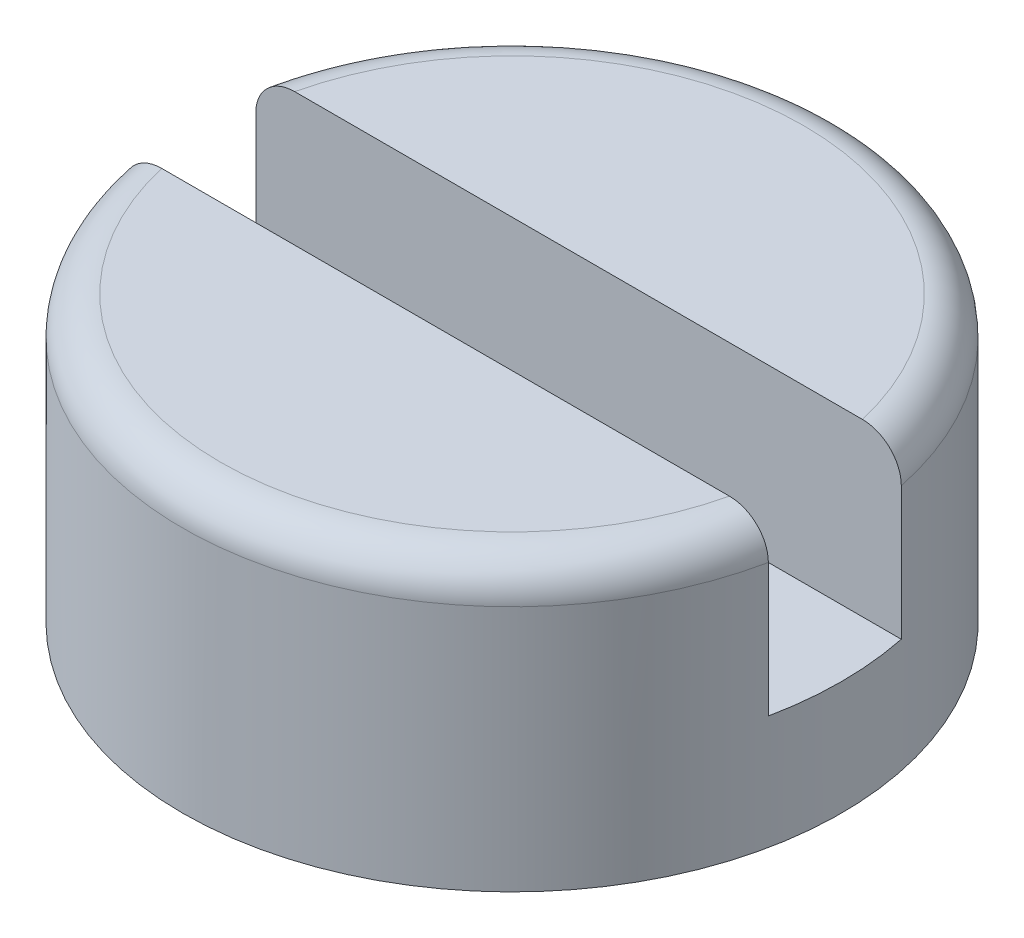
ISO-10303-21;
HEADER;
FILE_DESCRIPTION(('STEP AP214'),'2;1');
FILE_NAME('part.step','',(''),(''),'','','');
FILE_SCHEMA(('AUTOMOTIVE_DESIGN { 1 0 10303 214 1 1 1 1 }'));
ENDSEC;
DATA;
#1=APPLICATION_CONTEXT('core data for automotive mechanical design processes');
#2=APPLICATION_PROTOCOL_DEFINITION('international standard','automotive_design',2000,#1);
#3=PRODUCT_CONTEXT('',#1,'mechanical');
#4=PRODUCT('Part','Part','',(#3));
#5=PRODUCT_RELATED_PRODUCT_CATEGORY('part','',(#4));
#6=PRODUCT_DEFINITION_FORMATION('','',#4);
#7=PRODUCT_DEFINITION_CONTEXT('part definition',#1,'design');
#8=PRODUCT_DEFINITION('design','',#6,#7);
#9=PRODUCT_DEFINITION_SHAPE('','',#8);
#10=(LENGTH_UNIT() NAMED_UNIT(*) SI_UNIT(.MILLI.,.METRE.));
#11=(NAMED_UNIT(*) PLANE_ANGLE_UNIT() SI_UNIT($,.RADIAN.));
#12=(NAMED_UNIT(*) SI_UNIT($,.STERADIAN.) SOLID_ANGLE_UNIT());
#13=UNCERTAINTY_MEASURE_WITH_UNIT(LENGTH_MEASURE(1.E-05),#10,'distance_accuracy_value','');
#14=(GEOMETRIC_REPRESENTATION_CONTEXT(3) GLOBAL_UNCERTAINTY_ASSIGNED_CONTEXT((#13)) GLOBAL_UNIT_ASSIGNED_CONTEXT((#10,
#11,#12)) REPRESENTATION_CONTEXT('',''));
#15=CARTESIAN_POINT('',(0.,0.,0.));
#16=DIRECTION('',(0.,0.,1.));
#17=DIRECTION('',(1.,0.,0.));
#18=AXIS2_PLACEMENT_3D('',#15,#16,#17);
#19=CARTESIAN_POINT('',(0.,1.5,0.));
#20=DIRECTION('',(0.,1.,0.));
#21=DIRECTION('',(0.,0.,1.));
#22=AXIS2_PLACEMENT_3D('',#19,#20,#21);
#23=PLANE('',#22);
#24=DIRECTION('',(-1.,0.,0.));
#25=VECTOR('',#24,1.);
#26=CARTESIAN_POINT('',(0.,1.5,-0.35));
#27=LINE('',#26,#25);
#28=CARTESIAN_POINT('',(1.4945651541502,1.5,-0.35));
#29=VERTEX_POINT('',#28);
#30=CARTESIAN_POINT('',(-1.4945651541502,1.5,-0.35));
#31=VERTEX_POINT('',#30);
#32=EDGE_CURVE('E114',#29,#31,#27,.T.);
#33=ORIENTED_EDGE('',*,*,#32,.F.);
#34=CARTESIAN_POINT('',(0.,1.5,0.));
#35=DIRECTION('',(0.,1.,0.));
#36=DIRECTION('',(0.,0.,1.));
#37=AXIS2_PLACEMENT_3D('',#34,#35,#36);
#38=CIRCLE('',#37,1.535);
#39=EDGE_CURVE('E131',#29,#31,#38,.T.);
#40=ORIENTED_EDGE('',*,*,#39,.T.);
#41=EDGE_LOOP('',(#33,#40));
#42=FACE_BOUND('',#41,.T.);
#43=ADVANCED_FACE('F34',(#42),#23,.T.);
#44=CARTESIAN_POINT('',(0.,1.5,0.));
#45=DIRECTION('',(0.,-1.,0.));
#46=DIRECTION('',(0.,0.,-1.));
#47=AXIS2_PLACEMENT_3D('',#44,#45,#46);
#48=CYLINDRICAL_SURFACE('',#47,1.735);
#49=DIRECTION('',(0.,-1.,0.));
#50=VECTOR('',#49,1.);
#51=CARTESIAN_POINT('',(-1.6993307506192,1.5,-0.35));
#52=LINE('',#51,#50);
#53=CARTESIAN_POINT('',(-1.6993307506192,0.6,-0.35));
#54=VERTEX_POINT('',#53);
#55=CARTESIAN_POINT('',(-1.6993307506192,1.3,-0.35));
#56=VERTEX_POINT('',#55);
#57=EDGE_CURVE('E101',#54,#56,#52,.F.);
#58=ORIENTED_EDGE('',*,*,#57,.T.);
#59=CARTESIAN_POINT('',(0.,1.3,0.));
#60=DIRECTION('',(0.,1.,0.));
#61=DIRECTION('',(0.,0.,1.));
#62=AXIS2_PLACEMENT_3D('',#59,#60,#61);
#63=CIRCLE('',#62,1.735);
#64=CARTESIAN_POINT('',(1.6993307506192,1.3,-0.35));
#65=VERTEX_POINT('',#64);
#66=EDGE_CURVE('E169',#56,#65,#63,.F.);
#67=ORIENTED_EDGE('',*,*,#66,.T.);
#68=DIRECTION('',(0.,-1.,0.));
#69=VECTOR('',#68,1.);
#70=CARTESIAN_POINT('',(1.6993307506192,1.5,-0.35));
#71=LINE('',#70,#69);
#72=CARTESIAN_POINT('',(1.6993307506192,0.6,-0.35));
#73=VERTEX_POINT('',#72);
#74=EDGE_CURVE('E122',#65,#73,#71,.T.);
#75=ORIENTED_EDGE('',*,*,#74,.T.);
#76=CARTESIAN_POINT('',(0.,0.6,0.));
#77=DIRECTION('',(0.,1.,0.));
#78=DIRECTION('',(0.,0.,1.));
#79=AXIS2_PLACEMENT_3D('',#76,#77,#78);
#80=CIRCLE('',#79,1.735);
#81=CARTESIAN_POINT('',(1.6993307506192,0.6,0.35));
#82=VERTEX_POINT('',#81);
#83=EDGE_CURVE('E113',#82,#73,#80,.T.);
#84=ORIENTED_EDGE('',*,*,#83,.F.);
#85=DIRECTION('',(0.,-1.,0.));
#86=VECTOR('',#85,1.);
#87=CARTESIAN_POINT('',(1.6993307506192,1.5,0.35));
#88=LINE('',#87,#86);
#89=CARTESIAN_POINT('',(1.6993307506192,1.3,0.35));
#90=VERTEX_POINT('',#89);
#91=EDGE_CURVE('E102',#82,#90,#88,.F.);
#92=ORIENTED_EDGE('',*,*,#91,.T.);
#93=CARTESIAN_POINT('',(0.,1.3,0.));
#94=DIRECTION('',(0.,1.,0.));
#95=DIRECTION('',(0.,0.,1.));
#96=AXIS2_PLACEMENT_3D('',#93,#94,#95);
#97=CIRCLE('',#96,1.735);
#98=CARTESIAN_POINT('',(-1.6993307506192,1.3,0.35));
#99=VERTEX_POINT('',#98);
#100=EDGE_CURVE('E99',#90,#99,#97,.F.);
#101=ORIENTED_EDGE('',*,*,#100,.T.);
#102=DIRECTION('',(0.,-1.,0.));
#103=VECTOR('',#102,1.);
#104=CARTESIAN_POINT('',(-1.6993307506192,1.5,0.35));
#105=LINE('',#104,#103);
#106=CARTESIAN_POINT('',(-1.6993307506192,0.6,0.35));
#107=VERTEX_POINT('',#106);
#108=EDGE_CURVE('E92',#99,#107,#105,.T.);
#109=ORIENTED_EDGE('',*,*,#108,.T.);
#110=EDGE_CURVE('E97',#54,#107,#80,.T.);
#111=ORIENTED_EDGE('',*,*,#110,.F.);
#112=EDGE_LOOP('',(#58,#67,#75,#84,#92,#101,#109,#111));
#113=FACE_BOUND('',#112,.T.);
#114=CARTESIAN_POINT('',(0.,0.,0.));
#115=DIRECTION('',(0.,1.,0.));
#116=DIRECTION('',(0.,0.,1.));
#117=AXIS2_PLACEMENT_3D('',#114,#115,#116);
#118=CIRCLE('',#117,1.735);
#119=CARTESIAN_POINT('',(0.,0.,1.735));
#120=VERTEX_POINT('',#119);
#121=EDGE_CURVE('E124',#120,#120,#118,.T.);
#122=ORIENTED_EDGE('',*,*,#121,.T.);
#123=EDGE_LOOP('',(#122));
#124=FACE_BOUND('',#123,.T.);
#125=ADVANCED_FACE('F95',(#113,#124),#48,.T.);
#126=DIRECTION('',(1.,0.,0.));
#127=VECTOR('',#126,1.);
#128=CARTESIAN_POINT('',(0.,1.5,0.35));
#129=LINE('',#128,#127);
#130=CARTESIAN_POINT('',(-1.4945651541502,1.5,0.35));
#131=VERTEX_POINT('',#130);
#132=CARTESIAN_POINT('',(1.4945651541502,1.5,0.35));
#133=VERTEX_POINT('',#132);
#134=EDGE_CURVE('E127',#131,#133,#129,.T.);
#135=ORIENTED_EDGE('',*,*,#134,.F.);
#136=CARTESIAN_POINT('',(0.,1.5,0.));
#137=DIRECTION('',(0.,1.,0.));
#138=DIRECTION('',(0.,0.,1.));
#139=AXIS2_PLACEMENT_3D('',#136,#137,#138);
#140=CIRCLE('',#139,1.535);
#141=EDGE_CURVE('E167',#131,#133,#140,.T.);
#142=ORIENTED_EDGE('',*,*,#141,.T.);
#143=EDGE_LOOP('',(#135,#142));
#144=FACE_BOUND('',#143,.T.);
#145=ADVANCED_FACE('F159',(#144),#23,.T.);
#146=CARTESIAN_POINT('',(0.,0.,0.));
#147=DIRECTION('',(0.,1.,0.));
#148=DIRECTION('',(0.,0.,1.));
#149=AXIS2_PLACEMENT_3D('',#146,#147,#148);
#150=PLANE('',#149);
#151=ORIENTED_EDGE('',*,*,#121,.F.);
#152=EDGE_LOOP('',(#151));
#153=FACE_BOUND('',#152,.T.);
#154=ADVANCED_FACE('F182',(#153),#150,.F.);
#155=CARTESIAN_POINT('',(0.,0.6,0.));
#156=DIRECTION('',(0.,1.,0.));
#157=DIRECTION('',(0.,0.,1.));
#158=AXIS2_PLACEMENT_3D('',#155,#156,#157);
#159=PLANE('',#158);
#160=ORIENTED_EDGE('',*,*,#83,.T.);
#161=DIRECTION('',(-1.,0.,0.));
#162=VECTOR('',#161,1.);
#163=CARTESIAN_POINT('',(-1.75,0.6,-0.35));
#164=LINE('',#163,#162);
#165=EDGE_CURVE('E112',#73,#54,#164,.T.);
#166=ORIENTED_EDGE('',*,*,#165,.T.);
#167=ORIENTED_EDGE('',*,*,#110,.T.);
#168=DIRECTION('',(1.,0.,0.));
#169=VECTOR('',#168,1.);
#170=CARTESIAN_POINT('',(-1.75,0.6,0.35));
#171=LINE('',#170,#169);
#172=EDGE_CURVE('E109',#107,#82,#171,.T.);
#173=ORIENTED_EDGE('',*,*,#172,.T.);
#174=EDGE_LOOP('',(#160,#166,#167,#173));
#175=FACE_BOUND('',#174,.T.);
#176=ADVANCED_FACE('F108',(#175),#159,.T.);
#177=CARTESIAN_POINT('',(-1.75,0.6,-0.35));
#178=DIRECTION('',(0.,0.,-1.));
#179=DIRECTION('',(-1.,0.,0.));
#180=AXIS2_PLACEMENT_3D('',#177,#178,#179);
#181=PLANE('',#180);
#182=ORIENTED_EDGE('',*,*,#32,.T.);
#183=CARTESIAN_POINT('',(-1.4945651541502,1.5,-0.35));
#184=CARTESIAN_POINT('',(-1.50630264903016,1.50000888248519,-0.35));
#185=CARTESIAN_POINT('',(-1.51804009556239,1.49902090773793,-0.35));
#186=CARTESIAN_POINT('',(-1.54118815324756,1.49510621025857,-0.35));
#187=CARTESIAN_POINT('',(-1.55259873568124,1.49217931770905,-0.35));
#188=CARTESIAN_POINT('',(-1.57477383002671,1.48443839159623,-0.35));
#189=CARTESIAN_POINT('',(-1.58553776925385,1.4796227128778,-0.35));
#190=CARTESIAN_POINT('',(-1.60608338894305,1.46822845772231,-0.35));
#191=CARTESIAN_POINT('',(-1.61586551167648,1.46165067998844,-0.35));
#192=CARTESIAN_POINT('',(-1.634014835779,1.44701421423848,-0.35));
#193=CARTESIAN_POINT('',(-1.6424006953269,1.43897867639337,-0.35));
#194=CARTESIAN_POINT('',(-1.65766820798351,1.42158229886196,-0.35));
#195=CARTESIAN_POINT('',(-1.66454962330255,1.41222125005255,-0.35));
#196=CARTESIAN_POINT('',(-1.67644671719076,1.39266947402986,-0.35));
#197=CARTESIAN_POINT('',(-1.68150079203667,1.38250207401875,-0.35));
#198=CARTESIAN_POINT('',(-1.68979082381916,1.36145565783073,-0.35));
#199=CARTESIAN_POINT('',(-1.69302841734828,1.3505772921114,-0.35));
#200=CARTESIAN_POINT('',(-1.6966443592191,1.33300959530078,-0.35));
#201=CARTESIAN_POINT('',(-1.69765125150275,1.32644336213628,-0.35));
#202=CARTESIAN_POINT('',(-1.69899420709673,1.31325246222587,-0.35));
#203=CARTESIAN_POINT('',(-1.69933125810405,1.30662789600348,-0.35));
#204=CARTESIAN_POINT('',(-1.69933075061958,1.30000000000008,-0.35));
#205=B_SPLINE_CURVE_WITH_KNOTS('',3,(#183,#184,#185,#186,#187,#188,#189,#190,#191,#192,#193,
#194,#195,#196,#197,#198,#199,#200,#201,#202,#203,#204),.UNSPECIFIED.,.F.,.F.,(4,2,2,2,2,2,2,2,
2,2,4),(0.,0.0351712519876756,0.0703455848080195,0.105550623170674,0.140739731135361,
0.175412412639669,0.210090570487876,0.243990677309598,0.277860191951629,0.297758158171704,
0.317626762531104),.UNSPECIFIED.);
#206=EDGE_CURVE('E141',#31,#56,#205,.T.);
#207=ORIENTED_EDGE('',*,*,#206,.T.);
#208=ORIENTED_EDGE('',*,*,#57,.F.);
#209=ORIENTED_EDGE('',*,*,#165,.F.);
#210=ORIENTED_EDGE('',*,*,#74,.F.);
#211=CARTESIAN_POINT('',(1.6993307506192,1.3,-0.35));
#212=CARTESIAN_POINT('',(1.69934115758522,1.31107844119122,-0.35));
#213=CARTESIAN_POINT('',(1.69839160402869,1.32215281020102,-0.35));
#214=CARTESIAN_POINT('',(1.69465080145659,1.34397152279309,-0.35));
#215=CARTESIAN_POINT('',(1.69186199345477,1.35471628406991,-0.35));
#216=CARTESIAN_POINT('',(1.68451943027678,1.37558800263509,-0.35));
#217=CARTESIAN_POINT('',(1.67996514610552,1.38571477369951,-0.35));
#218=CARTESIAN_POINT('',(1.66923562599872,1.40506800306673,-0.35));
#219=CARTESIAN_POINT('',(1.6630604345171,1.41429448605071,-0.35));
#220=CARTESIAN_POINT('',(1.64921611625578,1.43167345509923,-0.35));
#221=CARTESIAN_POINT('',(1.64153506938856,1.43981643912636,-0.35));
#222=CARTESIAN_POINT('',(1.62493729385486,1.45472852783883,-0.35));
#223=CARTESIAN_POINT('',(1.61602031074643,1.46149734891651,-0.35));
#224=CARTESIAN_POINT('',(1.59701846759062,1.47361246984837,-0.35));
#225=CARTESIAN_POINT('',(1.58691397385444,1.47892793863864,-0.35));
#226=CARTESIAN_POINT('',(1.56597031192212,1.4878279617245,-0.35));
#227=CARTESIAN_POINT('',(1.55513129600635,1.49141287355298,-0.35));
#228=CARTESIAN_POINT('',(1.53597500271611,1.49605756824886,-0.35));
#229=CARTESIAN_POINT('',(1.52775639161109,1.49753585857844,-0.35));
#230=CARTESIAN_POINT('',(1.51121433459266,1.49950704710283,-0.35));
#231=CARTESIAN_POINT('',(1.50289106496655,1.50000142417372,-0.35));
#232=CARTESIAN_POINT('',(1.49456515415084,1.50000000000265,-0.35));
#233=B_SPLINE_CURVE_WITH_KNOTS('',3,(#211,#212,#213,#214,#215,#216,#217,#218,#219,#220,#221,
#222,#223,#224,#225,#226,#227,#228,#229,#230,#231,#232),.UNSPECIFIED.,.F.,.F.,(4,2,2,2,2,2,2,2,
2,2,4),(0.,0.0331886348360289,0.0663333109236925,0.0994879259392538,0.132641631773442,
0.16606922295658,0.19950370612081,0.233600419384765,0.267690085253024,0.292685457281765,
0.317643231423679),.UNSPECIFIED.);
#234=EDGE_CURVE('E134',#65,#29,#233,.T.);
#235=ORIENTED_EDGE('',*,*,#234,.T.);
#236=EDGE_LOOP('',(#182,#207,#208,#209,#210,#235));
#237=FACE_BOUND('',#236,.T.);
#238=ADVANCED_FACE('F150',(#237),#181,.F.);
#239=CARTESIAN_POINT('',(-1.75,0.6,0.35));
#240=DIRECTION('',(0.,0.,1.));
#241=DIRECTION('',(1.,0.,0.));
#242=AXIS2_PLACEMENT_3D('',#239,#240,#241);
#243=PLANE('',#242);
#244=ORIENTED_EDGE('',*,*,#134,.T.);
#245=CARTESIAN_POINT('',(1.4945651541502,1.5,0.35));
#246=CARTESIAN_POINT('',(1.50630264903016,1.50000888248519,0.35));
#247=CARTESIAN_POINT('',(1.51804009556239,1.49902090773793,0.35));
#248=CARTESIAN_POINT('',(1.54118815324756,1.49510621025857,0.35));
#249=CARTESIAN_POINT('',(1.55259873568124,1.49217931770905,0.35));
#250=CARTESIAN_POINT('',(1.57477383002671,1.48443839159623,0.35));
#251=CARTESIAN_POINT('',(1.58553776925385,1.4796227128778,0.35));
#252=CARTESIAN_POINT('',(1.60608338894305,1.46822845772231,0.35));
#253=CARTESIAN_POINT('',(1.61586551167648,1.46165067998844,0.35));
#254=CARTESIAN_POINT('',(1.634014835779,1.44701421423848,0.35));
#255=CARTESIAN_POINT('',(1.6424006953269,1.43897867639337,0.35));
#256=CARTESIAN_POINT('',(1.65766820798351,1.42158229886196,0.35));
#257=CARTESIAN_POINT('',(1.66454962330255,1.41222125005255,0.35));
#258=CARTESIAN_POINT('',(1.67644671719076,1.39266947402986,0.35));
#259=CARTESIAN_POINT('',(1.68150079203667,1.38250207401875,0.35));
#260=CARTESIAN_POINT('',(1.68979082381916,1.36145565783073,0.35));
#261=CARTESIAN_POINT('',(1.69302841734828,1.3505772921114,0.35));
#262=CARTESIAN_POINT('',(1.6966443592191,1.33300959530078,0.35));
#263=CARTESIAN_POINT('',(1.69765125150275,1.32644336213628,0.35));
#264=CARTESIAN_POINT('',(1.69899420709673,1.31325246222587,0.35));
#265=CARTESIAN_POINT('',(1.69933125810405,1.30662789600348,0.35));
#266=CARTESIAN_POINT('',(1.69933075061958,1.30000000000008,0.35));
#267=B_SPLINE_CURVE_WITH_KNOTS('',3,(#245,#246,#247,#248,#249,#250,#251,#252,#253,#254,#255,
#256,#257,#258,#259,#260,#261,#262,#263,#264,#265,#266),.UNSPECIFIED.,.F.,.F.,(4,2,2,2,2,2,2,2,
2,2,4),(0.,0.0351712519876756,0.0703455848080195,0.105550623170674,0.140739731135361,
0.175412412639669,0.210090570487876,0.243990677309598,0.277860191951629,0.297758158171704,
0.317626762531104),.UNSPECIFIED.);
#268=EDGE_CURVE('E11',#133,#90,#267,.T.);
#269=ORIENTED_EDGE('',*,*,#268,.T.);
#270=ORIENTED_EDGE('',*,*,#91,.F.);
#271=ORIENTED_EDGE('',*,*,#172,.F.);
#272=ORIENTED_EDGE('',*,*,#108,.F.);
#273=CARTESIAN_POINT('',(-1.6993307506192,1.3,0.35));
#274=CARTESIAN_POINT('',(-1.69934115758522,1.31107844119122,0.35));
#275=CARTESIAN_POINT('',(-1.69839160402869,1.32215281020102,0.35));
#276=CARTESIAN_POINT('',(-1.69465080145659,1.34397152279309,0.35));
#277=CARTESIAN_POINT('',(-1.69186199345477,1.35471628406991,0.35));
#278=CARTESIAN_POINT('',(-1.68451943027678,1.37558800263509,0.35));
#279=CARTESIAN_POINT('',(-1.67996514610552,1.38571477369951,0.35));
#280=CARTESIAN_POINT('',(-1.66923562599872,1.40506800306673,0.35));
#281=CARTESIAN_POINT('',(-1.6630604345171,1.41429448605071,0.35));
#282=CARTESIAN_POINT('',(-1.64921611625578,1.43167345509923,0.35));
#283=CARTESIAN_POINT('',(-1.64153506938856,1.43981643912636,0.35));
#284=CARTESIAN_POINT('',(-1.62493729385486,1.45472852783883,0.35));
#285=CARTESIAN_POINT('',(-1.61602031074643,1.46149734891651,0.35));
#286=CARTESIAN_POINT('',(-1.59701846759062,1.47361246984837,0.35));
#287=CARTESIAN_POINT('',(-1.58691397385444,1.47892793863864,0.35));
#288=CARTESIAN_POINT('',(-1.56597031192212,1.4878279617245,0.35));
#289=CARTESIAN_POINT('',(-1.55513129600635,1.49141287355298,0.35));
#290=CARTESIAN_POINT('',(-1.53597500271611,1.49605756824886,0.35));
#291=CARTESIAN_POINT('',(-1.52775639161109,1.49753585857844,0.35));
#292=CARTESIAN_POINT('',(-1.51121433459266,1.49950704710283,0.35));
#293=CARTESIAN_POINT('',(-1.50289106496655,1.50000142417372,0.35));
#294=CARTESIAN_POINT('',(-1.49456515415084,1.50000000000265,0.35));
#295=B_SPLINE_CURVE_WITH_KNOTS('',3,(#273,#274,#275,#276,#277,#278,#279,#280,#281,#282,#283,
#284,#285,#286,#287,#288,#289,#290,#291,#292,#293,#294),.UNSPECIFIED.,.F.,.F.,(4,2,2,2,2,2,2,2,
2,2,4),(0.,0.0331886348360289,0.0663333109236925,0.0994879259392538,0.132641631773442,
0.16606922295658,0.19950370612081,0.233600419384765,0.267690085253024,0.292685457281765,
0.317643231423679),.UNSPECIFIED.);
#296=EDGE_CURVE('E48',#99,#131,#295,.T.);
#297=ORIENTED_EDGE('',*,*,#296,.T.);
#298=EDGE_LOOP('',(#244,#269,#270,#271,#272,#297));
#299=FACE_BOUND('',#298,.T.);
#300=ADVANCED_FACE('F116',(#299),#243,.F.);
#301=CARTESIAN_POINT('',(0.,1.3,0.));
#302=DIRECTION('',(0.,1.,0.));
#303=DIRECTION('',(0.,0.,1.));
#304=AXIS2_PLACEMENT_3D('',#301,#302,#303);
#305=TOROIDAL_SURFACE('',#304,1.535,0.2);
#306=ORIENTED_EDGE('',*,*,#234,.F.);
#307=ORIENTED_EDGE('',*,*,#66,.F.);
#308=ORIENTED_EDGE('',*,*,#206,.F.);
#309=ORIENTED_EDGE('',*,*,#39,.F.);
#310=EDGE_LOOP('',(#306,#307,#308,#309));
#311=FACE_BOUND('',#310,.T.);
#312=ADVANCED_FACE('F147',(#311),#305,.T.);
#313=CARTESIAN_POINT('',(0.,1.3,0.));
#314=DIRECTION('',(0.,1.,0.));
#315=DIRECTION('',(0.,0.,1.));
#316=AXIS2_PLACEMENT_3D('',#313,#314,#315);
#317=TOROIDAL_SURFACE('',#316,1.535,0.2);
#318=ORIENTED_EDGE('',*,*,#296,.F.);
#319=ORIENTED_EDGE('',*,*,#100,.F.);
#320=ORIENTED_EDGE('',*,*,#268,.F.);
#321=ORIENTED_EDGE('',*,*,#141,.F.);
#322=EDGE_LOOP('',(#318,#319,#320,#321));
#323=FACE_BOUND('',#322,.T.);
#324=ADVANCED_FACE('F36',(#323),#317,.T.);
#325=CLOSED_SHELL('',(#43,#125,#145,#154,#176,#238,#300,#312,#324));
#326=MANIFOLD_SOLID_BREP('B2',#325);
#327=ADVANCED_BREP_SHAPE_REPRESENTATION('',(#18,#326),#14);
#328=SHAPE_DEFINITION_REPRESENTATION(#9,#327);
ENDSEC;
END-ISO-10303-21;
